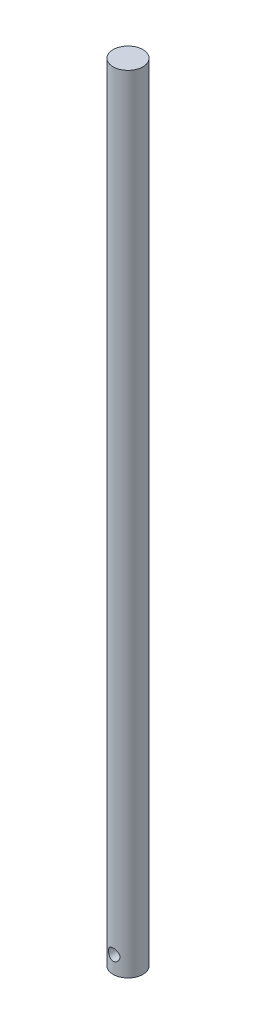
ISO-10303-21;
HEADER;
FILE_DESCRIPTION(('STEP AP214'),'2;1');
FILE_NAME('part.step','',(''),(''),'','','');
FILE_SCHEMA(('AUTOMOTIVE_DESIGN { 1 0 10303 214 1 1 1 1 }'));
ENDSEC;
DATA;
#1=APPLICATION_CONTEXT('core data for automotive mechanical design processes');
#2=APPLICATION_PROTOCOL_DEFINITION('international standard','automotive_design',2000,#1);
#3=PRODUCT_CONTEXT('',#1,'mechanical');
#4=PRODUCT('Part','Part','',(#3));
#5=PRODUCT_RELATED_PRODUCT_CATEGORY('part','',(#4));
#6=PRODUCT_DEFINITION_FORMATION('','',#4);
#7=PRODUCT_DEFINITION_CONTEXT('part definition',#1,'design');
#8=PRODUCT_DEFINITION('design','',#6,#7);
#9=PRODUCT_DEFINITION_SHAPE('','',#8);
#10=(LENGTH_UNIT() NAMED_UNIT(*) SI_UNIT(.MILLI.,.METRE.));
#11=(NAMED_UNIT(*) PLANE_ANGLE_UNIT() SI_UNIT($,.RADIAN.));
#12=(NAMED_UNIT(*) SI_UNIT($,.STERADIAN.) SOLID_ANGLE_UNIT());
#13=UNCERTAINTY_MEASURE_WITH_UNIT(LENGTH_MEASURE(1.E-05),#10,'distance_accuracy_value','');
#14=(GEOMETRIC_REPRESENTATION_CONTEXT(3) GLOBAL_UNCERTAINTY_ASSIGNED_CONTEXT((#13)) GLOBAL_UNIT_ASSIGNED_CONTEXT((#10,
#11,#12)) REPRESENTATION_CONTEXT('',''));
#15=CARTESIAN_POINT('',(0.,0.,0.));
#16=DIRECTION('',(0.,0.,1.));
#17=DIRECTION('',(1.,0.,0.));
#18=AXIS2_PLACEMENT_3D('',#15,#16,#17);
#19=CARTESIAN_POINT('',(0.,685.,0.));
#20=DIRECTION('',(0.,-1.,0.));
#21=DIRECTION('',(0.,0.,-1.));
#22=AXIS2_PLACEMENT_3D('',#19,#20,#21);
#23=CYLINDRICAL_SURFACE('',#22,13.);
#24=CARTESIAN_POINT('',(0.,20.,-13.));
#25=CARTESIAN_POINT('',(-0.135105435673312,20.0000007925324,-13.0000005927067));
#26=CARTESIAN_POINT('',(-0.270200171405511,19.994519845993,-12.9978893743678));
#27=CARTESIAN_POINT('',(-0.539422422253823,19.9726518318652,-12.9895020155898));
#28=CARTESIAN_POINT('',(-0.673549605560849,19.9562611873829,-12.9832245091782));
#29=CARTESIAN_POINT('',(-0.939715807173739,19.9127496401269,-12.9666767375276));
#30=CARTESIAN_POINT('',(-1.07175601768449,19.8856351122272,-12.9564088444598));
#31=CARTESIAN_POINT('',(-1.3329437331284,19.8209306611814,-12.9321488425649));
#32=CARTESIAN_POINT('',(-1.46209009143006,19.7833366623635,-12.918155284849));
#33=CARTESIAN_POINT('',(-1.71626719072218,19.6981213017031,-12.8868451049486));
#34=CARTESIAN_POINT('',(-1.84130713747875,19.6505244329863,-12.8695366087713));
#35=CARTESIAN_POINT('',(-2.08682707391249,19.545657472403,-12.832015127327));
#36=CARTESIAN_POINT('',(-2.20730535146954,19.4883837917652,-12.8118010649097));
#37=CARTESIAN_POINT('',(-2.56075981772143,19.3026980079109,-12.7475355462987));
#38=CARTESIAN_POINT('',(-2.78594772258954,19.1603562910481,-12.6998359612695));
#39=CARTESIAN_POINT('',(-3.2185789686031,18.8362544479534,-12.597313052833));
#40=CARTESIAN_POINT('',(-3.42495370206201,18.6531464892531,-12.5422812358283));
#41=CARTESIAN_POINT('',(-3.80503922947808,18.255341198418,-12.432249835349));
#42=CARTESIAN_POINT('',(-3.97873925666353,18.0406334951204,-12.3772502684319));
#43=CARTESIAN_POINT('',(-4.21450431929632,17.6941801871877,-12.2981799185099));
#44=CARTESIAN_POINT('',(-4.29018004395919,17.5719776731599,-12.2719168058643));
#45=CARTESIAN_POINT('',(-4.4309057073218,17.3211464150749,-12.221810214068));
#46=CARTESIAN_POINT('',(-4.49595992271105,17.1925202848275,-12.1979657625294));
#47=CARTESIAN_POINT('',(-4.6148935713999,16.929657369259,-12.1534684600532));
#48=CARTESIAN_POINT('',(-4.66877186590797,16.7954200138444,-12.1328159344175));
#49=CARTESIAN_POINT('',(-4.76480665522078,16.5223497636789,-12.095423710448));
#50=CARTESIAN_POINT('',(-4.80696888384188,16.3835191542167,-12.0786820987632));
#51=CARTESIAN_POINT('',(-4.87762040293412,16.1082207739342,-12.0503198066139));
#52=CARTESIAN_POINT('',(-4.90661231791615,15.9719011846075,-12.0385125764469));
#53=CARTESIAN_POINT('',(-4.95313223607861,15.6970617676641,-12.0194473814249));
#54=CARTESIAN_POINT('',(-4.97066531338868,15.5585429417705,-12.0121874030442));
#55=CARTESIAN_POINT('',(-4.99408302563348,15.2803793075591,-12.0024704237845));
#56=CARTESIAN_POINT('',(-4.99996965719274,15.1407346963641,-12.0000125996426));
#57=CARTESIAN_POINT('',(-5.00003010512815,14.8614456095668,-11.9999874994752));
#58=CARTESIAN_POINT('',(-4.99420440941855,14.7218011342011,-12.0024200197269));
#59=CARTESIAN_POINT('',(-4.97165500944641,14.4525325817535,-12.0117767674103));
#60=CARTESIAN_POINT('',(-4.95564978618669,14.3228372662534,-12.0184047390963));
#61=CARTESIAN_POINT('',(-4.91359264959725,14.0653148045601,-12.0356604838023));
#62=CARTESIAN_POINT('',(-4.88753741032902,13.9374882913761,-12.0462895809211));
#63=CARTESIAN_POINT('',(-4.82563229288976,13.6846272874163,-12.0712213668733));
#64=CARTESIAN_POINT('',(-4.78978489753152,13.5595920975784,-12.0855231244442));
#65=CARTESIAN_POINT('',(-4.70861515253987,13.3130453540775,-12.1173774555498));
#66=CARTESIAN_POINT('',(-4.6632891604567,13.1915351755117,-12.1349312784965));
#67=CARTESIAN_POINT('',(-4.51169850053317,12.8288288085381,-12.1924755684009));
#68=CARTESIAN_POINT('',(-4.39098115646825,12.5941807595978,-12.2368566049425));
#69=CARTESIAN_POINT('',(-4.11508008077258,12.1477851649799,-12.3323705335189));
#70=CARTESIAN_POINT('',(-3.95988402534363,11.9360458479593,-12.3835058370892));
#71=CARTESIAN_POINT('',(-3.60641390451617,11.5254932482652,-12.4912059619956));
#72=CARTESIAN_POINT('',(-3.40586385348079,11.3286646633701,-12.547898524282));
#73=CARTESIAN_POINT('',(-2.97397181625493,10.9708355583159,-12.6572139890731));
#74=CARTESIAN_POINT('',(-2.74262460418596,10.8098411311641,-12.7098361984904));
#75=CARTESIAN_POINT('',(-2.25041847939901,10.5258907566828,-12.8062280651032));
#76=CARTESIAN_POINT('',(-1.98912426672466,10.4036289166522,-12.849831794677));
#77=CARTESIAN_POINT('',(-1.44757926444761,10.2054675631724,-12.9220340480228));
#78=CARTESIAN_POINT('',(-1.16733741852609,10.1295463433498,-12.9506395961944));
#79=CARTESIAN_POINT('',(-0.612551756966853,10.0301157067375,-12.9883704552135));
#80=CARTESIAN_POINT('',(-0.338554328047597,10.0039323086041,-12.9984884298482));
#81=CARTESIAN_POINT('',(0.210076085685735,9.99689305742138,-13.0011941330225));
#82=CARTESIAN_POINT('',(0.48470890555464,10.0160265266958,-12.9937859911108));
#83=CARTESIAN_POINT('',(1.01504689296426,10.0970703564435,-12.962925017396));
#84=CARTESIAN_POINT('',(1.27106696392223,10.157201286592,-12.9401399980421));
#85=CARTESIAN_POINT('',(1.76918181812936,10.3161577863858,-12.8814960338562));
#86=CARTESIAN_POINT('',(2.01127479074599,10.4149883743112,-12.8456353935177));
#87=CARTESIAN_POINT('',(2.48279681684012,10.6517378163981,-12.7630227605536));
#88=CARTESIAN_POINT('',(2.71163049318208,10.7907374115982,-12.7159770820409));
#89=CARTESIAN_POINT('',(3.14348850543126,11.1026244696678,-12.6161681406778));
#90=CARTESIAN_POINT('',(3.34650292988259,11.275524881985,-12.5634026964437));
#91=CARTESIAN_POINT('',(3.73404077115936,11.662878300216,-12.4539121906904));
#92=CARTESIAN_POINT('',(3.91667798055548,11.8792239935575,-12.3971420955402));
#93=CARTESIAN_POINT('',(4.16163312635073,12.2249593701823,-12.3161782446639));
#94=CARTESIAN_POINT('',(4.23848974002245,12.343820308219,-12.289873951653));
#95=CARTESIAN_POINT('',(4.38201692653257,12.5879586194646,-12.2394322925437));
#96=CARTESIAN_POINT('',(4.44869179549097,12.7132332564961,-12.2152940142926));
#97=CARTESIAN_POINT('',(4.57172493159298,12.9702770754697,-12.1697850782984));
#98=CARTESIAN_POINT('',(4.62801200299334,13.1020837516495,-12.1484337939437));
#99=CARTESIAN_POINT('',(4.72918571297304,13.3704737027558,-12.1094072251449));
#100=CARTESIAN_POINT('',(4.77407724076336,13.5070549004797,-12.091730364796));
#101=CARTESIAN_POINT('',(4.85201021012296,13.7839895092144,-12.060669937985));
#102=CARTESIAN_POINT('',(4.88505562037159,13.9243416399186,-12.0472849338266));
#103=CARTESIAN_POINT('',(4.93893894806631,14.2077368628046,-12.0252955411119));
#104=CARTESIAN_POINT('',(4.95977777987583,14.3507797525999,-12.0166907944813));
#105=CARTESIAN_POINT('',(4.9880116261212,14.6286417476283,-12.0049970626604));
#106=CARTESIAN_POINT('',(4.99621847040098,14.7633649286132,-12.0015752478369));
#107=CARTESIAN_POINT('',(5.00171041804845,15.0331210854792,-11.9992876105759));
#108=CARTESIAN_POINT('',(4.99899184440318,15.1681541503697,-12.0004233220001));
#109=CARTESIAN_POINT('',(4.98265787836774,15.4373776948992,-12.0072143962966));
#110=CARTESIAN_POINT('',(4.96904772915468,15.5715685486574,-12.0128675844651));
#111=CARTESIAN_POINT('',(4.93107933323311,15.8382130489712,-12.0285026791905));
#112=CARTESIAN_POINT('',(4.90671703406572,15.9706660211233,-12.0384862178215));
#113=CARTESIAN_POINT('',(4.84850652361736,16.2283416799293,-12.0620452010056));
#114=CARTESIAN_POINT('',(4.81501180903614,16.3536566239988,-12.0754859016108));
#115=CARTESIAN_POINT('',(4.73853416167519,16.6009600013192,-12.1057001607466));
#116=CARTESIAN_POINT('',(4.69554785542336,16.7229472344822,-12.1224749040401));
#117=CARTESIAN_POINT('',(4.55286045692802,17.0827660075546,-12.1771051356997));
#118=CARTESIAN_POINT('',(4.43938737271726,17.3146453233734,-12.2192851727836));
#119=CARTESIAN_POINT('',(4.17198360886021,17.7691032228154,-12.3132307993958));
#120=CARTESIAN_POINT('',(4.01618977362697,17.990492000951,-12.3653926739532));
#121=CARTESIAN_POINT('',(3.67120048462145,18.4051339225477,-12.4721601632682));
#122=CARTESIAN_POINT('',(3.48199413993458,18.5983778545149,-12.5267665704834));
#123=CARTESIAN_POINT('',(3.17059659161174,18.8688191711001,-12.6079253809547));
#124=CARTESIAN_POINT('',(3.05874516817784,18.9578464430707,-12.6355919535733));
#125=CARTESIAN_POINT('',(2.82758971850484,19.1261539046131,-12.6893179499125));
#126=CARTESIAN_POINT('',(2.70828843330267,19.2054376476368,-12.7153779578068));
#127=CARTESIAN_POINT('',(2.46288880983495,19.3537051795325,-12.7651818071048));
#128=CARTESIAN_POINT('',(2.33678631133482,19.4226825645901,-12.788924205321));
#129=CARTESIAN_POINT('',(2.07872954179092,19.5496760860967,-12.833394576486));
#130=CARTESIAN_POINT('',(1.94677774199531,19.6076967981051,-12.8541238069116));
#131=CARTESIAN_POINT('',(1.66905616144646,19.7157057168791,-12.8932221452611));
#132=CARTESIAN_POINT('',(1.52294807232578,19.7649159007933,-12.9113467671101));
#133=CARTESIAN_POINT('',(1.22632421967701,19.8497344758145,-12.9428888987199));
#134=CARTESIAN_POINT('',(1.07580813790278,19.8853418822152,-12.956306067702));
#135=CARTESIAN_POINT('',(0.771832995773436,19.9424870872533,-12.9779612693703));
#136=CARTESIAN_POINT('',(0.618375385755343,19.9640316448644,-12.9862017900177));
#137=CARTESIAN_POINT('',(0.309940344022315,19.9927866174023,-12.9972204231694));
#138=CARTESIAN_POINT('',(0.154963133796174,19.9999990909819,-12.9999993201777));
#139=CARTESIAN_POINT('',(0.,20.,-13.));
#140=B_SPLINE_CURVE_WITH_KNOTS('',3,(#24,#25,#26,#27,#28,#29,#30,#31,#32,#33,#34,#35,#36,#37,
#38,#39,#40,#41,#42,#43,#44,#45,#46,#47,#48,#49,#50,#51,#52,#53,#54,#55,#56,#57,#58,#59,#60,#61,
#62,#63,#64,#65,#66,#67,#68,#69,#70,#71,#72,#73,#74,#75,#76,#77,#78,#79,#80,#81,#82,#83,#84,#85,
#86,#87,#88,#89,#90,#91,#92,#93,#94,#95,#96,#97,#98,#99,#100,#101,#102,#103,#104,#105,#106,#107,
#108,#109,#110,#111,#112,#113,#114,#115,#116,#117,#118,#119,#120,#121,#122,#123,#124,#125,#126,
#127,#128,#129,#130,#131,#132,#133,#134,#135,#136,#137,#138,#139),.UNSPECIFIED.,.T.,.F.,(4,2,2,
2,2,2,2,2,2,2,2,2,2,2,2,2,2,2,2,2,2,2,2,2,2,2,2,2,2,2,2,2,2,2,2,2,2,2,2,2,2,2,2,2,2,2,2,2,2,2,2,
2,2,2,2,2,2,4),(0.,0.405170848023328,0.810474602327436,1.21553778275227,1.62075872052339,
2.02499875603538,2.42938903961346,3.2375640766853,4.0780327597039,4.91877790560393,
5.35667473115164,5.794394802916,6.23215945510626,6.66970948741977,7.08876415435983,
7.50763313222298,7.92643029447945,8.34521001076972,8.73729047078399,9.12950079684894,
9.52161176967939,9.91387370132672,10.7128942176442,11.5122007903499,12.3682501617845,
13.224444979289,14.0952133233616,14.9655734778818,15.7876487749389,16.6095303917792,
17.3978369236401,18.1862457110234,18.9982364145579,19.8105378890114,20.6724430524304,
21.1039269088729,21.5352281974826,21.9693838477102,22.4033529092074,22.837176446471,
23.2709674829712,23.6755054058677,24.0801794897554,24.4846588816604,24.8892908512139,
25.2800632431878,25.6709747464754,26.4522151137474,27.2759013389124,28.0998565444818,
28.536246613355,28.9724770560682,29.4089774316316,29.8452951174649,30.3102744561234,
30.7752874483022,31.2400767781531,31.7047993410881),.UNSPECIFIED.);
#141=CARTESIAN_POINT('',(0.,20.,-13.));
#142=VERTEX_POINT('',#141);
#143=EDGE_CURVE('E10',#142,#142,#140,.T.);
#144=ORIENTED_EDGE('',*,*,#143,.T.);
#145=EDGE_LOOP('',(#144));
#146=FACE_BOUND('',#145,.T.);
#147=CARTESIAN_POINT('',(5.,15.,12.));
#148=CARTESIAN_POINT('',(5.00000082881613,14.8653123529974,11.9999992247433));
#149=CARTESIAN_POINT('',(4.99455342387228,14.7306356050677,12.0022736441231));
#150=CARTESIAN_POINT('',(4.97282280635548,14.4622639767234,12.0112935855066));
#151=CARTESIAN_POINT('',(4.95653619678685,14.3285694174104,12.018040509186));
#152=CARTESIAN_POINT('',(4.91330773531322,14.0632699069903,12.0357779144783));
#153=CARTESIAN_POINT('',(4.88637089233327,13.9316640037858,12.0467664011789));
#154=CARTESIAN_POINT('',(4.82210428093018,13.6713566856146,12.0726347069233));
#155=CARTESIAN_POINT('',(4.78477038484994,13.542656446187,12.0875160713072));
#156=CARTESIAN_POINT('',(4.70018308018826,13.2894328927653,12.1206572964134));
#157=CARTESIAN_POINT('',(4.65295928639198,13.1648983676463,12.1389070517252));
#158=CARTESIAN_POINT('',(4.54892827026334,12.9203519068511,12.178273405626));
#159=CARTESIAN_POINT('',(4.49211747480485,12.8003416778817,12.1993910725257));
#160=CARTESIAN_POINT('',(4.3079329010497,12.4481819109536,12.2661639732805));
#161=CARTESIAN_POINT('',(4.16674626637893,12.2237230131015,12.315264047553));
#162=CARTESIAN_POINT('',(3.84389890567132,11.7904825531632,12.4199259315798));
#163=CARTESIAN_POINT('',(3.66063123496654,11.5829561763389,12.4756840890016));
#164=CARTESIAN_POINT('',(3.26199720264933,11.2005893305439,12.5857846517958));
#165=CARTESIAN_POINT('',(3.04662354790097,11.0257563085312,12.6401267321911));
#166=CARTESIAN_POINT('',(2.69933823282318,10.7887949145487,12.7172486902396));
#167=CARTESIAN_POINT('',(2.57715678961722,10.7129259550275,12.7426295829735));
#168=CARTESIAN_POINT('',(2.32633590296588,10.571813897463,12.7907947749641));
#169=CARTESIAN_POINT('',(2.19769908961016,10.5065665171572,12.8135801195403));
#170=CARTESIAN_POINT('',(1.93480556473683,10.387259462571,12.8559038119244));
#171=CARTESIAN_POINT('',(1.80054804746156,10.3332013989865,12.8754416921819));
#172=CARTESIAN_POINT('',(1.52745746079034,10.2368262072364,12.9106859610612));
#173=CARTESIAN_POINT('',(1.38862661372393,10.1945034679737,12.9263941803517));
#174=CARTESIAN_POINT('',(1.11371005562278,10.1236396230604,12.952909343403));
#175=CARTESIAN_POINT('',(0.977779442684615,10.0945666201748,12.9639041356431));
#176=CARTESIAN_POINT('',(0.703753902978717,10.0478248659427,12.9816628385847));
#177=CARTESIAN_POINT('',(0.565659935120396,10.0301512005773,12.9884285723073));
#178=CARTESIAN_POINT('',(0.288346070676312,10.0063818454658,12.9975421377902));
#179=CARTESIAN_POINT('',(0.149126276619449,10.0002851130731,12.9998903674015));
#180=CARTESIAN_POINT('',(-0.129337630252722,9.99973446646697,13.0001021020133));
#181=CARTESIAN_POINT('',(-0.268581742145071,10.0052801789203,12.9979657508189));
#182=CARTESIAN_POINT('',(-0.538727073330276,10.0273578307193,12.98949862049));
#183=CARTESIAN_POINT('',(-0.669684022518476,10.0433005229822,12.9833928618404));
#184=CARTESIAN_POINT('',(-0.929745505416012,10.0854368836667,12.967364837828));
#185=CARTESIAN_POINT('',(-1.05884940587238,10.111633973804,12.9574412985565));
#186=CARTESIAN_POINT('',(-1.31424001145404,10.1740237108392,12.9340331018187));
#187=CARTESIAN_POINT('',(-1.44052763049968,10.2102130625614,12.920549618389));
#188=CARTESIAN_POINT('',(-1.68956232607867,10.2922853255043,12.8903499565864));
#189=CARTESIAN_POINT('',(-1.81230803541952,10.3381719244887,12.8736325485905));
#190=CARTESIAN_POINT('',(-2.05520791311507,10.4399885768441,12.8371107949432));
#191=CARTESIAN_POINT('',(-2.17529944323581,10.4960535521721,12.817265520295));
#192=CARTESIAN_POINT('',(-2.41034266382558,10.6173336801099,12.7751530150294));
#193=CARTESIAN_POINT('',(-2.52529248400354,10.6825521271607,12.7528849130599));
#194=CARTESIAN_POINT('',(-2.86142600379893,10.8912666469325,12.6832349094644));
#195=CARTESIAN_POINT('',(-3.0740563771238,11.0478904561601,12.6329817779422));
#196=CARTESIAN_POINT('',(-3.48377818827651,11.4026008665235,12.5264097158771));
#197=CARTESIAN_POINT('',(-3.67912062891834,11.6026392338849,12.4699077819188));
#198=CARTESIAN_POINT('',(-4.03426183575593,12.0331066169758,12.35958538621));
#199=CARTESIAN_POINT('',(-4.1940506963897,12.2635440737644,12.3057656749849));
#200=CARTESIAN_POINT('',(-4.40529924645727,12.6306097324236,12.2310715412748));
#201=CARTESIAN_POINT('',(-4.47160912455526,12.7582451502653,12.206920898198));
#202=CARTESIAN_POINT('',(-4.59315477898542,13.0191898235161,12.1617076101385));
#203=CARTESIAN_POINT('',(-4.64839528455993,13.1524966262633,12.1406436474505));
#204=CARTESIAN_POINT('',(-4.74727893593916,13.4238640905269,12.1023204028012));
#205=CARTESIAN_POINT('',(-4.79092262305156,13.5619245298165,12.0850609432626));
#206=CARTESIAN_POINT('',(-4.86614002364445,13.8417047243996,12.054970975577));
#207=CARTESIAN_POINT('',(-4.8977197497181,13.9834226191456,12.0421382614815));
#208=CARTESIAN_POINT('',(-4.94701915594769,14.2612471270571,12.0219660942915));
#209=CARTESIAN_POINT('',(-4.96542722794782,14.3972121415568,12.0143548370848));
#210=CARTESIAN_POINT('',(-4.99100300619214,14.6703196294359,12.0037528526857));
#211=CARTESIAN_POINT('',(-4.9981755851275,14.8074615664376,12.0007601225049));
#212=CARTESIAN_POINT('',(-5.00121220676694,15.0818867849872,11.9994949550419));
#213=CARTESIAN_POINT('',(-4.9970766830916,15.2191700609133,12.0012223367624));
#214=CARTESIAN_POINT('',(-4.97754677597633,15.4927898043493,12.0093354837696));
#215=CARTESIAN_POINT('',(-4.96215263445856,15.6291262921398,12.0157211489605));
#216=CARTESIAN_POINT('',(-4.92134877527802,15.892862404731,12.0324887914208));
#217=CARTESIAN_POINT('',(-4.89649271625903,16.0203619793026,12.0426492147559));
#218=CARTESIAN_POINT('',(-4.83704361756377,16.2727299189609,12.0666492078948));
#219=CARTESIAN_POINT('',(-4.80244734763272,16.3975973963439,12.080489998175));
#220=CARTESIAN_POINT('',(-4.68448681408629,16.7669950743803,12.1269460401614));
#221=CARTESIAN_POINT('',(-4.58691805489369,17.0065294729892,12.1645092579918));
#222=CARTESIAN_POINT('',(-4.35253327709063,17.4752465652947,12.2503678398183));
#223=CARTESIAN_POINT('',(-4.21434420046917,17.7036696109049,12.2990223580299));
#224=CARTESIAN_POINT('',(-3.90408978796588,18.1350827915061,12.4009984837417));
#225=CARTESIAN_POINT('',(-3.73201150803181,18.3380631599837,12.45432187019));
#226=CARTESIAN_POINT('',(-3.34501227397095,18.727065062052,12.5639890430706));
#227=CARTESIAN_POINT('',(-3.12798735646809,18.9110258104738,12.6202945760816));
#228=CARTESIAN_POINT('',(-2.78085942067525,19.1577719469097,12.6996462856537));
#229=CARTESIAN_POINT('',(-2.66147674056532,19.2351909671536,12.7252590262454));
#230=CARTESIAN_POINT('',(-2.41619842047371,19.3797504131684,12.7740981223201));
#231=CARTESIAN_POINT('',(-2.29030559920844,19.4468952383534,12.7973254978082));
#232=CARTESIAN_POINT('',(-2.03305568687082,19.5702299814807,12.8407038184911));
#233=CARTESIAN_POINT('',(-1.901709228375,19.6264401036889,12.860860422368));
#234=CARTESIAN_POINT('',(-1.6342924443839,19.7275265510521,12.897569113984));
#235=CARTESIAN_POINT('',(-1.49822413487523,19.7724076470144,12.9141227185894));
#236=CARTESIAN_POINT('',(-1.22235552997843,19.8504010017798,12.9431479478705));
#237=CARTESIAN_POINT('',(-1.08255597346956,19.8835155723271,12.9556203743286));
#238=CARTESIAN_POINT('',(-0.800311256660266,19.9376254506986,12.9761132930229));
#239=CARTESIAN_POINT('',(-0.657866259001659,19.9586215010407,12.9841340580172));
#240=CARTESIAN_POINT('',(-0.380277796429815,19.9873492453333,12.9951333117407));
#241=CARTESIAN_POINT('',(-0.245220716574455,19.9958137824762,12.9983902341067));
#242=CARTESIAN_POINT('',(0.0252194264457512,20.0017658963002,13.0006789690954));
#243=CARTESIAN_POINT('',(0.160602584277399,19.9992497658298,12.9997093548094));
#244=CARTESIAN_POINT('',(0.430554883463316,19.9832615841691,12.9935692543529));
#245=CARTESIAN_POINT('',(0.565124398328388,19.9697950171938,12.9884008710178));
#246=CARTESIAN_POINT('',(0.832565577916945,19.9320463638192,12.9740039239069));
#247=CARTESIAN_POINT('',(0.965436590018776,19.9077602414933,12.9647738450472));
#248=CARTESIAN_POINT('',(1.22490509190231,19.8494123537059,12.9428006564225));
#249=CARTESIAN_POINT('',(1.35157495918848,19.8156339743212,12.9301597564698));
#250=CARTESIAN_POINT('',(1.60155272378267,19.7383723532089,12.9015849951842));
#251=CARTESIAN_POINT('',(1.72485942027011,19.6948856947519,12.8856499746657));
#252=CARTESIAN_POINT('',(2.08851272925371,19.550386121148,12.8334664874846));
#253=CARTESIAN_POINT('',(2.32280643886681,19.435285043894,12.7928205330528));
#254=CARTESIAN_POINT('',(2.7790485312304,19.165366833108,12.7017119525913));
#255=CARTESIAN_POINT('',(3.00003403514584,19.0090558136106,12.6509025935713));
#256=CARTESIAN_POINT('',(3.41364272375818,18.6632808818486,12.5456199924595));
#257=CARTESIAN_POINT('',(3.60625554382522,18.4738049093604,12.4911454219883));
#258=CARTESIAN_POINT('',(3.87545948181824,18.1624557175584,12.4092839862152));
#259=CARTESIAN_POINT('',(3.96394499799336,18.0508130966189,12.3812317996127));
#260=CARTESIAN_POINT('',(4.13119860096755,17.8201876810333,12.3264319937183));
#261=CARTESIAN_POINT('',(4.20997017284514,17.7012075419902,12.2996839086476));
#262=CARTESIAN_POINT('',(4.35727519474284,17.4565348740168,12.2482754136666));
#263=CARTESIAN_POINT('',(4.42580189423075,17.3308379926902,12.2236163848693));
#264=CARTESIAN_POINT('',(4.5519771141895,17.0736465494364,12.1771927016893));
#265=CARTESIAN_POINT('',(4.60963020345641,16.9421544512818,12.1554268328193));
#266=CARTESIAN_POINT('',(4.71704435186088,16.6652315469536,12.114166418144));
#267=CARTESIAN_POINT('',(4.76601864003179,16.519456927166,12.0949214923029));
#268=CARTESIAN_POINT('',(4.8504197588214,16.2235546527828,12.0613222664174));
#269=CARTESIAN_POINT('',(4.8858528201546,16.0734290345022,12.0469657174202));
#270=CARTESIAN_POINT('',(4.94273192670927,15.7701874868737,12.0237409999024));
#271=CARTESIAN_POINT('',(4.96418334747221,15.6170727301117,12.0148707221343));
#272=CARTESIAN_POINT('',(4.99281584309142,15.3093003703863,12.0030011054821));
#273=CARTESIAN_POINT('',(4.99999904838627,15.1546430012222,12.0000008901189));
#274=CARTESIAN_POINT('',(5.,15.,12.));
#275=B_SPLINE_CURVE_WITH_KNOTS('',3,(#147,#148,#149,#150,#151,#152,#153,#154,#155,#156,#157,
#158,#159,#160,#161,#162,#163,#164,#165,#166,#167,#168,#169,#170,#171,#172,#173,#174,#175,#176,
#177,#178,#179,#180,#181,#182,#183,#184,#185,#186,#187,#188,#189,#190,#191,#192,#193,#194,#195,
#196,#197,#198,#199,#200,#201,#202,#203,#204,#205,#206,#207,#208,#209,#210,#211,#212,#213,#214,
#215,#216,#217,#218,#219,#220,#221,#222,#223,#224,#225,#226,#227,#228,#229,#230,#231,#232,#233,
#234,#235,#236,#237,#238,#239,#240,#241,#242,#243,#244,#245,#246,#247,#248,#249,#250,#251,#252,
#253,#254,#255,#256,#257,#258,#259,#260,#261,#262,#263,#264,#265,#266,#267,#268,#269,#270,#271,
#272,#273,#274),.UNSPECIFIED.,.T.,.F.,(4,2,2,2,2,2,2,2,2,2,2,2,2,2,2,2,2,2,2,2,2,2,2,2,2,2,2,2,
2,2,2,2,2,2,2,2,2,2,2,2,2,2,2,2,2,2,2,2,2,2,2,2,2,2,2,2,2,2,2,2,2,2,2,4),(0.,0.403915616763553,
0.807957879917796,1.211810343043,1.61582336577006,2.01864346134148,2.42161402301772,
3.22698630687601,4.07070244356512,4.9146105301288,5.35228274150097,5.78977805883209,
6.22733630964201,6.66468498531289,7.08246567463974,7.50006614675625,7.91762900697814,
8.33517847759804,8.73090822346638,9.12677013025217,9.52250164816183,9.91838393039697,
10.3199583516389,10.7216776765908,11.5245874379306,12.3766665645389,13.2289827919766,
13.6660562034489,14.1029424811029,14.5398083625201,14.9764562281144,15.3881737968393,
15.7997127593803,16.2112359412667,16.6227502807132,17.0131771123939,17.4037335785129,
18.1842181381819,18.9949152522463,19.8059226164205,20.671512582598,21.1048066404815,
21.5379146393341,21.9702146122401,22.4023322328825,22.8343649092931,23.2663711116777,
23.6719504897412,24.0776668048761,24.4831800535708,24.8888446942392,25.2834927786295,
25.6782799749436,26.4672016939802,27.290018407999,28.1131349580629,28.548282021554,
28.9832725100078,29.4185483701411,29.8536409297205,30.3178624056192,30.7818700217209,
31.2456991347488,31.7094589865758),.UNSPECIFIED.);
#276=CARTESIAN_POINT('',(5.,15.,12.));
#277=VERTEX_POINT('',#276);
#278=EDGE_CURVE('E51',#277,#277,#275,.T.);
#279=ORIENTED_EDGE('',*,*,#278,.T.);
#280=EDGE_LOOP('',(#279));
#281=FACE_BOUND('',#280,.T.);
#282=CARTESIAN_POINT('',(0.,685.,0.));
#283=DIRECTION('',(0.,1.,0.));
#284=DIRECTION('',(0.,0.,1.));
#285=AXIS2_PLACEMENT_3D('',#282,#283,#284);
#286=CIRCLE('',#285,13.);
#287=CARTESIAN_POINT('',(0.,685.,13.));
#288=VERTEX_POINT('',#287);
#289=EDGE_CURVE('E56',#288,#288,#286,.T.);
#290=ORIENTED_EDGE('',*,*,#289,.F.);
#291=EDGE_LOOP('',(#290));
#292=FACE_BOUND('',#291,.T.);
#293=CARTESIAN_POINT('',(0.,0.,0.));
#294=DIRECTION('',(0.,1.,0.));
#295=DIRECTION('',(0.,0.,1.));
#296=AXIS2_PLACEMENT_3D('',#293,#294,#295);
#297=CIRCLE('',#296,13.);
#298=CARTESIAN_POINT('',(0.,0.,13.));
#299=VERTEX_POINT('',#298);
#300=EDGE_CURVE('E61',#299,#299,#297,.T.);
#301=ORIENTED_EDGE('',*,*,#300,.T.);
#302=EDGE_LOOP('',(#301));
#303=FACE_BOUND('',#302,.T.);
#304=ADVANCED_FACE('F39',(#146,#281,#292,#303),#23,.T.);
#305=CARTESIAN_POINT('',(0.,685.,0.));
#306=DIRECTION('',(0.,1.,0.));
#307=DIRECTION('',(0.,0.,1.));
#308=AXIS2_PLACEMENT_3D('',#305,#306,#307);
#309=PLANE('',#308);
#310=ORIENTED_EDGE('',*,*,#289,.T.);
#311=EDGE_LOOP('',(#310));
#312=FACE_BOUND('',#311,.T.);
#313=ADVANCED_FACE('F73',(#312),#309,.T.);
#314=CARTESIAN_POINT('',(0.,0.,0.));
#315=DIRECTION('',(0.,1.,0.));
#316=DIRECTION('',(0.,0.,1.));
#317=AXIS2_PLACEMENT_3D('',#314,#315,#316);
#318=PLANE('',#317);
#319=ORIENTED_EDGE('',*,*,#300,.F.);
#320=EDGE_LOOP('',(#319));
#321=FACE_BOUND('',#320,.T.);
#322=ADVANCED_FACE('F71',(#321),#318,.F.);
#323=CARTESIAN_POINT('',(0.,15.,-13.));
#324=DIRECTION('',(0.,0.,1.));
#325=DIRECTION('',(1.,0.,0.));
#326=AXIS2_PLACEMENT_3D('',#323,#324,#325);
#327=CYLINDRICAL_SURFACE('',#326,5.);
#328=ORIENTED_EDGE('',*,*,#278,.F.);
#329=EDGE_LOOP('',(#328));
#330=FACE_BOUND('',#329,.T.);
#331=ORIENTED_EDGE('',*,*,#143,.F.);
#332=EDGE_LOOP('',(#331));
#333=FACE_BOUND('',#332,.T.);
#334=ADVANCED_FACE('F67',(#330,#333),#327,.F.);
#335=CLOSED_SHELL('',(#304,#313,#322,#334));
#336=MANIFOLD_SOLID_BREP('B2',#335);
#337=ADVANCED_BREP_SHAPE_REPRESENTATION('',(#18,#336),#14);
#338=SHAPE_DEFINITION_REPRESENTATION(#9,#337);
ENDSEC;
END-ISO-10303-21;
